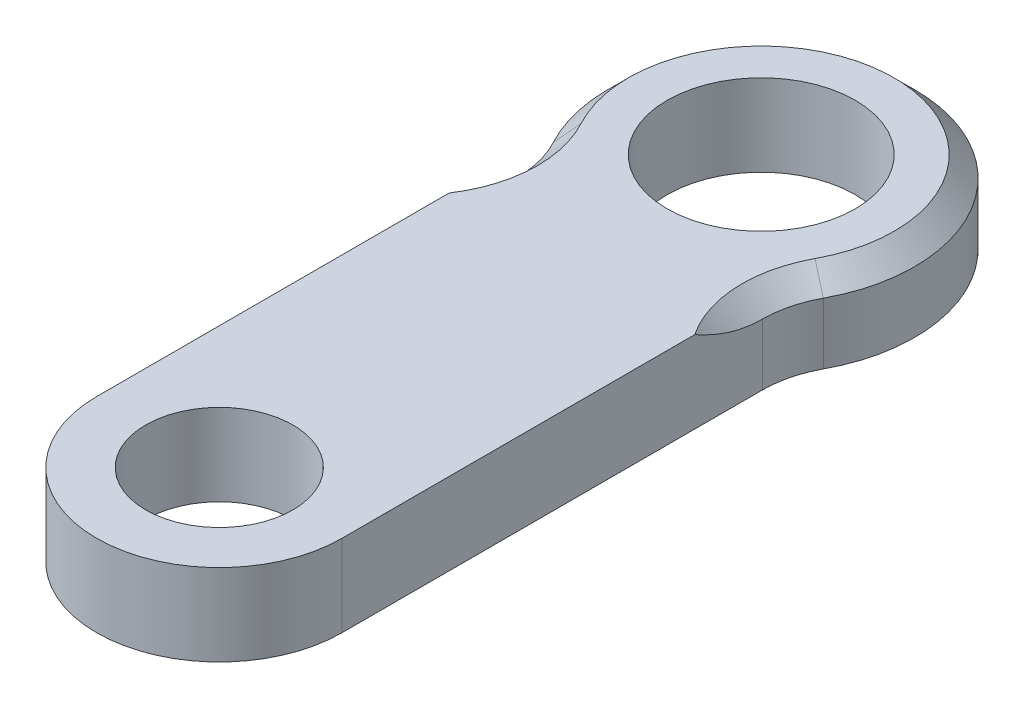
ISO-10303-21;
HEADER;
FILE_DESCRIPTION(('STEP AP214'),'2;1');
FILE_NAME('part.step','',(''),(''),'','','');
FILE_SCHEMA(('AUTOMOTIVE_DESIGN { 1 0 10303 214 1 1 1 1 }'));
ENDSEC;
DATA;
#1=APPLICATION_CONTEXT('core data for automotive mechanical design processes');
#2=APPLICATION_PROTOCOL_DEFINITION('international standard','automotive_design',2000,#1);
#3=PRODUCT_CONTEXT('',#1,'mechanical');
#4=PRODUCT('Part','Part','',(#3));
#5=PRODUCT_RELATED_PRODUCT_CATEGORY('part','',(#4));
#6=PRODUCT_DEFINITION_FORMATION('','',#4);
#7=PRODUCT_DEFINITION_CONTEXT('part definition',#1,'design');
#8=PRODUCT_DEFINITION('design','',#6,#7);
#9=PRODUCT_DEFINITION_SHAPE('','',#8);
#10=(LENGTH_UNIT() NAMED_UNIT(*) SI_UNIT(.MILLI.,.METRE.));
#11=(NAMED_UNIT(*) PLANE_ANGLE_UNIT() SI_UNIT($,.RADIAN.));
#12=(NAMED_UNIT(*) SI_UNIT($,.STERADIAN.) SOLID_ANGLE_UNIT());
#13=UNCERTAINTY_MEASURE_WITH_UNIT(LENGTH_MEASURE(1.E-05),#10,'distance_accuracy_value','');
#14=(GEOMETRIC_REPRESENTATION_CONTEXT(3) GLOBAL_UNCERTAINTY_ASSIGNED_CONTEXT((#13)) GLOBAL_UNIT_ASSIGNED_CONTEXT((#10,
#11,#12)) REPRESENTATION_CONTEXT('',''));
#15=CARTESIAN_POINT('',(0.,0.,0.));
#16=DIRECTION('',(0.,0.,1.));
#17=DIRECTION('',(1.,0.,0.));
#18=AXIS2_PLACEMENT_3D('',#15,#16,#17);
#19=CARTESIAN_POINT('',(0.,4.,0.));
#20=DIRECTION('',(0.,1.,0.));
#21=DIRECTION('',(0.,0.,1.));
#22=AXIS2_PLACEMENT_3D('',#19,#20,#21);
#23=PLANE('',#22);
#24=CARTESIAN_POINT('',(0.,4.,0.));
#25=DIRECTION('',(0.,1.,0.));
#26=DIRECTION('',(0.,0.,1.));
#27=AXIS2_PLACEMENT_3D('',#24,#25,#26);
#28=CIRCLE('',#27,6.50000000000001);
#29=CARTESIAN_POINT('',(5.72,4.,3.08732894262986));
#30=VERTEX_POINT('',#29);
#31=CARTESIAN_POINT('',(-5.72,4.,3.08732894262986));
#32=VERTEX_POINT('',#31);
#33=EDGE_CURVE('E148',#30,#32,#28,.T.);
#34=ORIENTED_EDGE('',*,*,#33,.T.);
#35=CARTESIAN_POINT('',(-11.,4.,5.93717104351896));
#36=DIRECTION('',(0.,1.,0.));
#37=DIRECTION('',(0.,0.,1.));
#38=AXIS2_PLACEMENT_3D('',#35,#36,#37);
#39=CIRCLE('',#38,6.);
#40=CARTESIAN_POINT('',(-6.,4.,9.25379583387436));
#41=VERTEX_POINT('',#40);
#42=EDGE_CURVE('E108',#32,#41,#39,.F.);
#43=ORIENTED_EDGE('',*,*,#42,.T.);
#44=DIRECTION('',(0.,0.,1.));
#45=VECTOR('',#44,1.);
#46=CARTESIAN_POINT('',(-6.,4.,0.));
#47=LINE('',#46,#45);
#48=CARTESIAN_POINT('',(-6.,4.,26.5));
#49=VERTEX_POINT('',#48);
#50=EDGE_CURVE('E100',#41,#49,#47,.T.);
#51=ORIENTED_EDGE('',*,*,#50,.T.);
#52=CARTESIAN_POINT('',(0.,4.,26.5));
#53=DIRECTION('',(0.,1.,0.));
#54=DIRECTION('',(0.,0.,1.));
#55=AXIS2_PLACEMENT_3D('',#52,#53,#54);
#56=CIRCLE('',#55,6.);
#57=CARTESIAN_POINT('',(6.,4.,26.5));
#58=VERTEX_POINT('',#57);
#59=EDGE_CURVE('E105',#49,#58,#56,.T.);
#60=ORIENTED_EDGE('',*,*,#59,.T.);
#61=DIRECTION('',(0.,0.,-1.));
#62=VECTOR('',#61,1.);
#63=CARTESIAN_POINT('',(6.,4.,0.));
#64=LINE('',#63,#62);
#65=CARTESIAN_POINT('',(6.,4.,9.25379583387435));
#66=VERTEX_POINT('',#65);
#67=EDGE_CURVE('E125',#58,#66,#64,.T.);
#68=ORIENTED_EDGE('',*,*,#67,.T.);
#69=CARTESIAN_POINT('',(11.,4.,5.93717104351896));
#70=DIRECTION('',(0.,1.,0.));
#71=DIRECTION('',(0.,0.,1.));
#72=AXIS2_PLACEMENT_3D('',#69,#70,#71);
#73=CIRCLE('',#72,5.99999999999999);
#74=EDGE_CURVE('E150',#66,#30,#73,.F.);
#75=ORIENTED_EDGE('',*,*,#74,.T.);
#76=EDGE_LOOP('',(#34,#43,#51,#60,#68,#75));
#77=FACE_BOUND('',#76,.T.);
#78=CARTESIAN_POINT('',(0.,4.,26.5));
#79=DIRECTION('',(0.,1.,0.));
#80=DIRECTION('',(0.,0.,1.));
#81=AXIS2_PLACEMENT_3D('',#78,#79,#80);
#82=CIRCLE('',#81,3.6);
#83=CARTESIAN_POINT('',(0.,4.,30.1));
#84=VERTEX_POINT('',#83);
#85=EDGE_CURVE('E217',#84,#84,#82,.T.);
#86=ORIENTED_EDGE('',*,*,#85,.F.);
#87=EDGE_LOOP('',(#86));
#88=FACE_BOUND('',#87,.T.);
#89=CARTESIAN_POINT('',(0.,4.,0.));
#90=DIRECTION('',(0.,1.,0.));
#91=DIRECTION('',(0.,0.,1.));
#92=AXIS2_PLACEMENT_3D('',#89,#90,#91);
#93=CIRCLE('',#92,4.6);
#94=CARTESIAN_POINT('',(0.,4.,4.6));
#95=VERTEX_POINT('',#94);
#96=EDGE_CURVE('E132',#95,#95,#93,.T.);
#97=ORIENTED_EDGE('',*,*,#96,.F.);
#98=EDGE_LOOP('',(#97));
#99=FACE_BOUND('',#98,.T.);
#100=ADVANCED_FACE('F32',(#77,#88,#99),#23,.T.);
#101=CARTESIAN_POINT('',(0.,0.,0.));
#102=DIRECTION('',(0.,1.,0.));
#103=DIRECTION('',(0.,0.,1.));
#104=AXIS2_PLACEMENT_3D('',#101,#102,#103);
#105=PLANE('',#104);
#106=DIRECTION('',(0.,0.,1.));
#107=VECTOR('',#106,1.);
#108=CARTESIAN_POINT('',(-6.,0.,0.));
#109=LINE('',#108,#107);
#110=CARTESIAN_POINT('',(-6.,0.,5.93717104351896));
#111=VERTEX_POINT('',#110);
#112=CARTESIAN_POINT('',(-6.,0.,26.5));
#113=VERTEX_POINT('',#112);
#114=EDGE_CURVE('E116',#111,#113,#109,.T.);
#115=ORIENTED_EDGE('',*,*,#114,.F.);
#116=CARTESIAN_POINT('',(-11.,0.,5.93717104351896));
#117=DIRECTION('',(0.,1.,0.));
#118=DIRECTION('',(0.,0.,1.));
#119=AXIS2_PLACEMENT_3D('',#116,#117,#118);
#120=CIRCLE('',#119,5.);
#121=CARTESIAN_POINT('',(-6.6,0.,3.56230262611138));
#122=VERTEX_POINT('',#121);
#123=EDGE_CURVE('E146',#111,#122,#120,.T.);
#124=ORIENTED_EDGE('',*,*,#123,.T.);
#125=CARTESIAN_POINT('',(0.,0.,0.));
#126=DIRECTION('',(0.,1.,0.));
#127=DIRECTION('',(0.,0.,1.));
#128=AXIS2_PLACEMENT_3D('',#125,#126,#127);
#129=CIRCLE('',#128,7.5);
#130=CARTESIAN_POINT('',(6.6,0.,3.56230262611138));
#131=VERTEX_POINT('',#130);
#132=EDGE_CURVE('E207',#122,#131,#129,.F.);
#133=ORIENTED_EDGE('',*,*,#132,.T.);
#134=CARTESIAN_POINT('',(11.,0.,5.93717104351896));
#135=DIRECTION('',(0.,1.,0.));
#136=DIRECTION('',(0.,0.,1.));
#137=AXIS2_PLACEMENT_3D('',#134,#135,#136);
#138=CIRCLE('',#137,5.);
#139=CARTESIAN_POINT('',(6.,0.,5.93717104351896));
#140=VERTEX_POINT('',#139);
#141=EDGE_CURVE('E144',#131,#140,#138,.T.);
#142=ORIENTED_EDGE('',*,*,#141,.T.);
#143=DIRECTION('',(0.,0.,-1.));
#144=VECTOR('',#143,1.);
#145=CARTESIAN_POINT('',(6.,0.,0.));
#146=LINE('',#145,#144);
#147=CARTESIAN_POINT('',(6.,0.,26.5));
#148=VERTEX_POINT('',#147);
#149=EDGE_CURVE('E110',#148,#140,#146,.T.);
#150=ORIENTED_EDGE('',*,*,#149,.F.);
#151=CARTESIAN_POINT('',(0.,0.,26.5));
#152=DIRECTION('',(0.,1.,0.));
#153=DIRECTION('',(0.,0.,1.));
#154=AXIS2_PLACEMENT_3D('',#151,#152,#153);
#155=CIRCLE('',#154,6.);
#156=EDGE_CURVE('E131',#113,#148,#155,.T.);
#157=ORIENTED_EDGE('',*,*,#156,.F.);
#158=EDGE_LOOP('',(#115,#124,#133,#142,#150,#157));
#159=FACE_BOUND('',#158,.T.);
#160=CARTESIAN_POINT('',(0.,0.,26.5));
#161=DIRECTION('',(0.,1.,0.));
#162=DIRECTION('',(0.,0.,1.));
#163=AXIS2_PLACEMENT_3D('',#160,#161,#162);
#164=CIRCLE('',#163,3.6);
#165=CARTESIAN_POINT('',(0.,0.,30.1));
#166=VERTEX_POINT('',#165);
#167=EDGE_CURVE('E212',#166,#166,#164,.T.);
#168=ORIENTED_EDGE('',*,*,#167,.T.);
#169=EDGE_LOOP('',(#168));
#170=FACE_BOUND('',#169,.T.);
#171=CARTESIAN_POINT('',(0.,0.,0.));
#172=DIRECTION('',(0.,1.,0.));
#173=DIRECTION('',(0.,0.,1.));
#174=AXIS2_PLACEMENT_3D('',#171,#172,#173);
#175=CIRCLE('',#174,4.6);
#176=CARTESIAN_POINT('',(0.,0.,4.6));
#177=VERTEX_POINT('',#176);
#178=EDGE_CURVE('E221',#177,#177,#175,.T.);
#179=ORIENTED_EDGE('',*,*,#178,.T.);
#180=EDGE_LOOP('',(#179));
#181=FACE_BOUND('',#180,.T.);
#182=ADVANCED_FACE('F169',(#159,#170,#181),#105,.F.);
#183=CARTESIAN_POINT('',(-6.,4.,0.));
#184=DIRECTION('',(1.,0.,0.));
#185=DIRECTION('',(0.,0.,-1.));
#186=AXIS2_PLACEMENT_3D('',#183,#184,#185);
#187=PLANE('',#186);
#188=ORIENTED_EDGE('',*,*,#50,.F.);
#189=CARTESIAN_POINT('',(-6.,4.,9.25379583387436));
#190=CARTESIAN_POINT('',(-6.,3.94996268300957,9.16326206154948));
#191=CARTESIAN_POINT('',(-6.,3.90100046774487,9.07212415392003));
#192=CARTESIAN_POINT('',(-6.,3.80557595171609,8.88859053536756));
#193=CARTESIAN_POINT('',(-6.,3.75911279314257,8.79619526985918));
#194=CARTESIAN_POINT('',(-6.,3.66880551404554,8.60963096853182));
#195=CARTESIAN_POINT('',(-6.,3.62497363610688,8.5154559746133));
#196=CARTESIAN_POINT('',(-6.,3.54052538038491,8.32561222615069));
#197=CARTESIAN_POINT('',(-6.,3.49991090055358,8.22994262918778));
#198=CARTESIAN_POINT('',(-6.,3.38566792585428,7.94589011122965));
#199=CARTESIAN_POINT('',(-6.,3.31714831441447,7.75540373365389));
#200=CARTESIAN_POINT('',(-6.,3.19774948115708,7.36902695243631));
#201=CARTESIAN_POINT('',(-6.,3.1468535797549,7.17314184895305));
#202=CARTESIAN_POINT('',(-6.,3.08934551744874,6.89025655728356));
#203=CARTESIAN_POINT('',(-6.,3.07404523102396,6.8049806668486));
#204=CARTESIAN_POINT('',(-6.,3.04758463466865,6.63377541192982));
#205=CARTESIAN_POINT('',(-6.,3.03642454909035,6.54784601229058));
#206=CARTESIAN_POINT('',(-6.,3.01835047760031,6.37459030154969));
#207=CARTESIAN_POINT('',(-6.,3.01148425215417,6.28725898961558));
#208=CARTESIAN_POINT('',(-6.,3.00230119692227,6.11234401668391));
#209=CARTESIAN_POINT('',(-6.,2.99998511208674,6.02476031671561));
#210=CARTESIAN_POINT('',(-6.,3.,5.93717104351896));
#211=B_SPLINE_CURVE_WITH_KNOTS('',3,(#189,#190,#191,#192,#193,#194,#195,#196,#197,#198,#199,
#200,#201,#202,#203,#204,#205,#206,#207,#208,#209,#210),.UNSPECIFIED.,.F.,.F.,(4,2,2,2,2,2,2,2,
2,2,4),(0.,0.310328932161107,0.620550654029963,0.93211882010437,1.2438694332414,
1.85049055337936,2.45653597054647,2.71636584969536,2.9762098066401,3.23889486253268,
3.50162292171018),.UNSPECIFIED.);
#212=CARTESIAN_POINT('',(-6.,3.,5.93717104351896));
#213=VERTEX_POINT('',#212);
#214=EDGE_CURVE('E153',#41,#213,#211,.T.);
#215=ORIENTED_EDGE('',*,*,#214,.T.);
#216=DIRECTION('',(0.,1.,0.));
#217=VECTOR('',#216,1.);
#218=CARTESIAN_POINT('',(-6.,4.,5.93717104351896));
#219=LINE('',#218,#217);
#220=EDGE_CURVE('E142',#213,#111,#219,.F.);
#221=ORIENTED_EDGE('',*,*,#220,.T.);
#222=ORIENTED_EDGE('',*,*,#114,.T.);
#223=DIRECTION('',(0.,-1.,0.));
#224=VECTOR('',#223,1.);
#225=CARTESIAN_POINT('',(-6.,4.,26.5));
#226=LINE('',#225,#224);
#227=EDGE_CURVE('E113',#49,#113,#226,.T.);
#228=ORIENTED_EDGE('',*,*,#227,.F.);
#229=EDGE_LOOP('',(#188,#215,#221,#222,#228));
#230=FACE_BOUND('',#229,.T.);
#231=ADVANCED_FACE('F114',(#230),#187,.F.);
#232=CARTESIAN_POINT('',(0.,4.,26.5));
#233=DIRECTION('',(0.,-1.,0.));
#234=DIRECTION('',(0.,0.,-1.));
#235=AXIS2_PLACEMENT_3D('',#232,#233,#234);
#236=CYLINDRICAL_SURFACE('',#235,6.);
#237=ORIENTED_EDGE('',*,*,#156,.T.);
#238=DIRECTION('',(0.,-1.,0.));
#239=VECTOR('',#238,1.);
#240=CARTESIAN_POINT('',(6.,4.,26.5));
#241=LINE('',#240,#239);
#242=EDGE_CURVE('E120',#58,#148,#241,.T.);
#243=ORIENTED_EDGE('',*,*,#242,.F.);
#244=ORIENTED_EDGE('',*,*,#59,.F.);
#245=ORIENTED_EDGE('',*,*,#227,.T.);
#246=EDGE_LOOP('',(#237,#243,#244,#245));
#247=FACE_BOUND('',#246,.T.);
#248=ADVANCED_FACE('F122',(#247),#236,.T.);
#249=CARTESIAN_POINT('',(6.,4.,0.));
#250=DIRECTION('',(-1.,0.,0.));
#251=DIRECTION('',(0.,0.,1.));
#252=AXIS2_PLACEMENT_3D('',#249,#250,#251);
#253=PLANE('',#252);
#254=DIRECTION('',(0.,1.,0.));
#255=VECTOR('',#254,1.);
#256=CARTESIAN_POINT('',(6.,4.,5.93717104351896));
#257=LINE('',#256,#255);
#258=CARTESIAN_POINT('',(6.,3.00000000000001,5.93717104351896));
#259=VERTEX_POINT('',#258);
#260=EDGE_CURVE('E119',#140,#259,#257,.T.);
#261=ORIENTED_EDGE('',*,*,#260,.T.);
#262=CARTESIAN_POINT('',(6.,3.00000000000001,5.93717104351896));
#263=CARTESIAN_POINT('',(6.,2.99999382674003,6.01400532858564));
#264=CARTESIAN_POINT('',(6.,3.00177193800074,6.0908281710955));
#265=CARTESIAN_POINT('',(6.,3.00883863855219,6.24430032971356));
#266=CARTESIAN_POINT('',(6.,3.01412666753713,6.32094967155924));
#267=CARTESIAN_POINT('',(6.,3.0351403107065,6.55013124706359));
#268=CARTESIAN_POINT('',(6.,3.05601596425572,6.70221663011979));
#269=CARTESIAN_POINT('',(6.,3.10996200881457,7.00163701139083));
#270=CARTESIAN_POINT('',(6.,3.14283197140961,7.14900908218956));
#271=CARTESIAN_POINT('',(6.,3.21934221870079,7.4409644167203));
#272=CARTESIAN_POINT('',(6.,3.26298670240563,7.58554656943405));
#273=CARTESIAN_POINT('',(6.,3.35551711688329,7.85989367793443));
#274=CARTESIAN_POINT('',(6.,3.40368381857015,7.98990435593535));
#275=CARTESIAN_POINT('',(6.,3.50660545874856,8.24728222993848));
#276=CARTESIAN_POINT('',(6.,3.56136067917103,8.37464931254432));
#277=CARTESIAN_POINT('',(6.,3.67730994951876,8.62879808128025));
#278=CARTESIAN_POINT('',(6.,3.73859098237246,8.7555397716215));
#279=CARTESIAN_POINT('',(6.,3.86592990694776,9.00649330671809));
#280=CARTESIAN_POINT('',(6.,3.93198436950055,9.13070688701347));
#281=CARTESIAN_POINT('',(6.,4.,9.25379583387435));
#282=B_SPLINE_CURVE_WITH_KNOTS('',3,(#262,#263,#264,#265,#266,#267,#268,#269,#270,#271,#272,
#273,#274,#275,#276,#277,#278,#279,#280,#281),.UNSPECIFIED.,.F.,.F.,(4,2,2,2,2,2,2,2,2,4),(0.,
0.23046041026972,0.460884039831826,0.92077610932009,1.37331103380714,1.82602259780301,
2.2417593096915,2.65751381780304,3.0797420084624,3.50166983486671),.UNSPECIFIED.);
#283=EDGE_CURVE('E42',#259,#66,#282,.T.);
#284=ORIENTED_EDGE('',*,*,#283,.T.);
#285=ORIENTED_EDGE('',*,*,#67,.F.);
#286=ORIENTED_EDGE('',*,*,#242,.T.);
#287=ORIENTED_EDGE('',*,*,#149,.T.);
#288=EDGE_LOOP('',(#261,#284,#285,#286,#287));
#289=FACE_BOUND('',#288,.T.);
#290=ADVANCED_FACE('F193',(#289),#253,.F.);
#291=CARTESIAN_POINT('',(0.,4.,0.));
#292=DIRECTION('',(0.,-1.,0.));
#293=DIRECTION('',(0.,0.,-1.));
#294=AXIS2_PLACEMENT_3D('',#291,#292,#293);
#295=CYLINDRICAL_SURFACE('',#294,4.6);
#296=ORIENTED_EDGE('',*,*,#96,.T.);
#297=EDGE_LOOP('',(#296));
#298=FACE_BOUND('',#297,.T.);
#299=ORIENTED_EDGE('',*,*,#178,.F.);
#300=EDGE_LOOP('',(#299));
#301=FACE_BOUND('',#300,.T.);
#302=ADVANCED_FACE('F191',(#298,#301),#295,.F.);
#303=CARTESIAN_POINT('',(0.,4.,26.5));
#304=DIRECTION('',(0.,-1.,0.));
#305=DIRECTION('',(0.,0.,-1.));
#306=AXIS2_PLACEMENT_3D('',#303,#304,#305);
#307=CYLINDRICAL_SURFACE('',#306,3.6);
#308=ORIENTED_EDGE('',*,*,#85,.T.);
#309=EDGE_LOOP('',(#308));
#310=FACE_BOUND('',#309,.T.);
#311=ORIENTED_EDGE('',*,*,#167,.F.);
#312=EDGE_LOOP('',(#311));
#313=FACE_BOUND('',#312,.T.);
#314=ADVANCED_FACE('F229',(#310,#313),#307,.F.);
#315=CARTESIAN_POINT('',(0.,-21.2132034355964,0.));
#316=DIRECTION('',(0.,1.,0.));
#317=DIRECTION('',(0.,0.,1.));
#318=AXIS2_PLACEMENT_3D('',#315,#316,#317);
#319=CYLINDRICAL_SURFACE('',#318,7.5);
#320=DIRECTION('',(0.,1.,0.));
#321=VECTOR('',#320,1.);
#322=CARTESIAN_POINT('',(-6.6,-21.2132034355964,3.56230262611138));
#323=LINE('',#322,#321);
#324=CARTESIAN_POINT('',(-6.6,3.,3.56230262611138));
#325=VERTEX_POINT('',#324);
#326=EDGE_CURVE('E138',#122,#325,#323,.T.);
#327=ORIENTED_EDGE('',*,*,#326,.T.);
#328=CARTESIAN_POINT('',(0.,3.,0.));
#329=DIRECTION('',(0.,1.,0.));
#330=DIRECTION('',(0.,0.,1.));
#331=AXIS2_PLACEMENT_3D('',#328,#329,#330);
#332=CIRCLE('',#331,7.5);
#333=CARTESIAN_POINT('',(6.6,3.,3.56230262611138));
#334=VERTEX_POINT('',#333);
#335=EDGE_CURVE('E11',#325,#334,#332,.F.);
#336=ORIENTED_EDGE('',*,*,#335,.T.);
#337=DIRECTION('',(0.,1.,0.));
#338=VECTOR('',#337,1.);
#339=CARTESIAN_POINT('',(6.6,-21.2132034355964,3.56230262611138));
#340=LINE('',#339,#338);
#341=EDGE_CURVE('E140',#334,#131,#340,.F.);
#342=ORIENTED_EDGE('',*,*,#341,.T.);
#343=ORIENTED_EDGE('',*,*,#132,.F.);
#344=EDGE_LOOP('',(#327,#336,#342,#343));
#345=FACE_BOUND('',#344,.T.);
#346=ADVANCED_FACE('F174',(#345),#319,.T.);
#347=CARTESIAN_POINT('',(11.,-21.2132034355964,5.93717104351896));
#348=DIRECTION('',(0.,1.,0.));
#349=DIRECTION('',(0.,0.,1.));
#350=AXIS2_PLACEMENT_3D('',#347,#348,#349);
#351=CYLINDRICAL_SURFACE('',#350,5.);
#352=ORIENTED_EDGE('',*,*,#341,.F.);
#353=CARTESIAN_POINT('',(11.,3.00000000000001,5.93717104351896));
#354=DIRECTION('',(0.,1.,0.));
#355=DIRECTION('',(0.,0.,1.));
#356=AXIS2_PLACEMENT_3D('',#353,#354,#355);
#357=CIRCLE('',#356,5.);
#358=EDGE_CURVE('E50',#334,#259,#357,.T.);
#359=ORIENTED_EDGE('',*,*,#358,.T.);
#360=ORIENTED_EDGE('',*,*,#260,.F.);
#361=ORIENTED_EDGE('',*,*,#141,.F.);
#362=EDGE_LOOP('',(#352,#359,#360,#361));
#363=FACE_BOUND('',#362,.T.);
#364=ADVANCED_FACE('F171',(#363),#351,.F.);
#365=CARTESIAN_POINT('',(-11.,-21.2132034355964,5.93717104351896));
#366=DIRECTION('',(0.,1.,0.));
#367=DIRECTION('',(0.,0.,1.));
#368=AXIS2_PLACEMENT_3D('',#365,#366,#367);
#369=CYLINDRICAL_SURFACE('',#368,5.);
#370=ORIENTED_EDGE('',*,*,#220,.F.);
#371=CARTESIAN_POINT('',(-11.,3.,5.93717104351896));
#372=DIRECTION('',(0.,1.,0.));
#373=DIRECTION('',(0.,0.,1.));
#374=AXIS2_PLACEMENT_3D('',#371,#372,#373);
#375=CIRCLE('',#374,5.);
#376=EDGE_CURVE('E160',#213,#325,#375,.T.);
#377=ORIENTED_EDGE('',*,*,#376,.T.);
#378=ORIENTED_EDGE('',*,*,#326,.F.);
#379=ORIENTED_EDGE('',*,*,#123,.F.);
#380=EDGE_LOOP('',(#370,#377,#378,#379));
#381=FACE_BOUND('',#380,.T.);
#382=ADVANCED_FACE('F173',(#381),#369,.F.);
#383=CARTESIAN_POINT('',(11.,4.,5.93717104351896));
#384=DIRECTION('',(0.,1.,0.));
#385=DIRECTION('',(0.,0.,1.));
#386=AXIS2_PLACEMENT_3D('',#383,#384,#385);
#387=CONICAL_SURFACE('',#386,5.99999999999999,0.785398163397448);
#388=ORIENTED_EDGE('',*,*,#283,.F.);
#389=ORIENTED_EDGE('',*,*,#358,.F.);
#390=DIRECTION('',(0.622253967444162,-0.707106781186547,0.335857112474933));
#391=VECTOR('',#390,1.);
#392=CARTESIAN_POINT('',(5.72000000000001,4.,3.08732894262986));
#393=LINE('',#392,#391);
#394=EDGE_CURVE('E37',#30,#334,#393,.T.);
#395=ORIENTED_EDGE('',*,*,#394,.F.);
#396=ORIENTED_EDGE('',*,*,#74,.F.);
#397=EDGE_LOOP('',(#388,#389,#395,#396));
#398=FACE_BOUND('',#397,.T.);
#399=ADVANCED_FACE('F34',(#398),#387,.F.);
#400=CARTESIAN_POINT('',(0.,4.,0.));
#401=DIRECTION('',(0.,-1.,0.));
#402=DIRECTION('',(0.,0.,-1.));
#403=AXIS2_PLACEMENT_3D('',#400,#401,#402);
#404=CONICAL_SURFACE('',#403,6.50000000000001,0.785398163397447);
#405=ORIENTED_EDGE('',*,*,#394,.T.);
#406=ORIENTED_EDGE('',*,*,#335,.F.);
#407=DIRECTION('',(-0.622253967444161,-0.707106781186548,0.335857112474933));
#408=VECTOR('',#407,1.);
#409=CARTESIAN_POINT('',(-5.72,4.,3.08732894262986));
#410=LINE('',#409,#408);
#411=EDGE_CURVE('E201',#32,#325,#410,.T.);
#412=ORIENTED_EDGE('',*,*,#411,.F.);
#413=ORIENTED_EDGE('',*,*,#33,.F.);
#414=EDGE_LOOP('',(#405,#406,#412,#413));
#415=FACE_BOUND('',#414,.T.);
#416=ADVANCED_FACE('F180',(#415),#404,.T.);
#417=CARTESIAN_POINT('',(-11.,4.,5.93717104351896));
#418=DIRECTION('',(0.,1.,0.));
#419=DIRECTION('',(0.,0.,1.));
#420=AXIS2_PLACEMENT_3D('',#417,#418,#419);
#421=CONICAL_SURFACE('',#420,6.,0.785398163397449);
#422=ORIENTED_EDGE('',*,*,#411,.T.);
#423=ORIENTED_EDGE('',*,*,#376,.F.);
#424=ORIENTED_EDGE('',*,*,#214,.F.);
#425=ORIENTED_EDGE('',*,*,#42,.F.);
#426=EDGE_LOOP('',(#422,#423,#424,#425));
#427=FACE_BOUND('',#426,.T.);
#428=ADVANCED_FACE('F162',(#427),#421,.F.);
#429=CLOSED_SHELL('',(#100,#182,#231,#248,#290,#302,#314,#346,#364,#382,#399,#416,#428));
#430=MANIFOLD_SOLID_BREP('B2',#429);
#431=ADVANCED_BREP_SHAPE_REPRESENTATION('',(#18,#430),#14);
#432=SHAPE_DEFINITION_REPRESENTATION(#9,#431);
ENDSEC;
END-ISO-10303-21;
